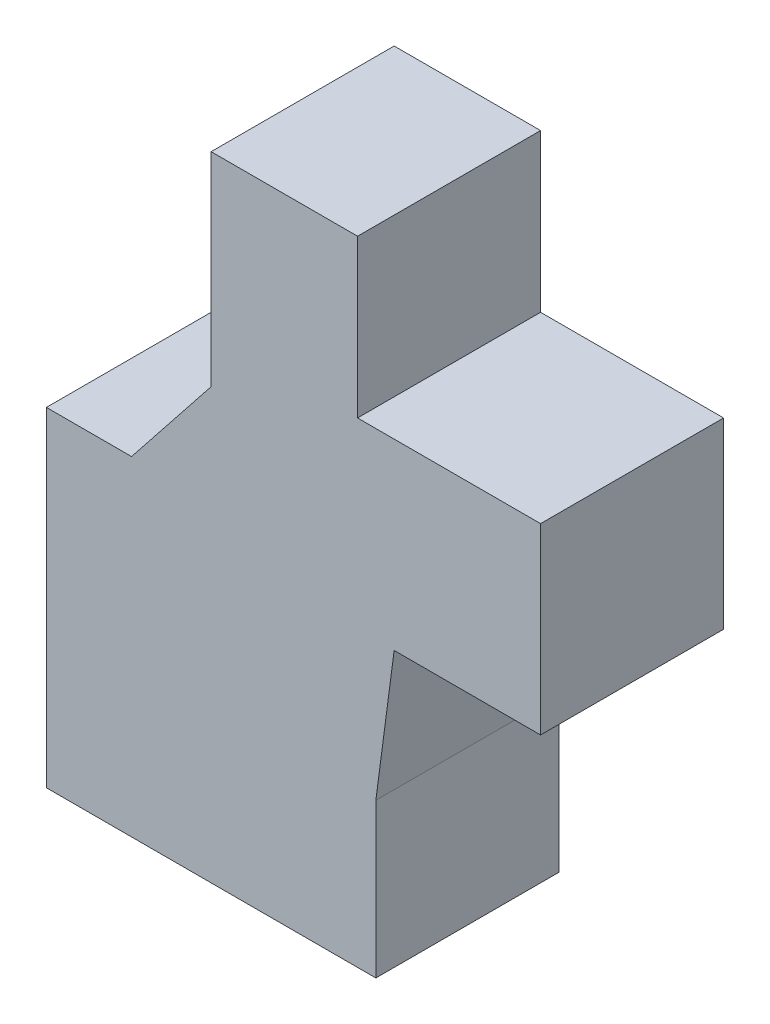
ISO-10303-21;
HEADER;
FILE_DESCRIPTION(('STEP AP214'),'2;1');
FILE_NAME('part.step','',(''),(''),'','','');
FILE_SCHEMA(('AUTOMOTIVE_DESIGN { 1 0 10303 214 1 1 1 1 }'));
ENDSEC;
DATA;
#1=APPLICATION_CONTEXT('core data for automotive mechanical design processes');
#2=APPLICATION_PROTOCOL_DEFINITION('international standard','automotive_design',2000,#1);
#3=PRODUCT_CONTEXT('',#1,'mechanical');
#4=PRODUCT('Part','Part','',(#3));
#5=PRODUCT_RELATED_PRODUCT_CATEGORY('part','',(#4));
#6=PRODUCT_DEFINITION_FORMATION('','',#4);
#7=PRODUCT_DEFINITION_CONTEXT('part definition',#1,'design');
#8=PRODUCT_DEFINITION('design','',#6,#7);
#9=PRODUCT_DEFINITION_SHAPE('','',#8);
#10=(LENGTH_UNIT() NAMED_UNIT(*) SI_UNIT(.MILLI.,.METRE.));
#11=(NAMED_UNIT(*) PLANE_ANGLE_UNIT() SI_UNIT($,.RADIAN.));
#12=(NAMED_UNIT(*) SI_UNIT($,.STERADIAN.) SOLID_ANGLE_UNIT());
#13=UNCERTAINTY_MEASURE_WITH_UNIT(LENGTH_MEASURE(1.E-05),#10,'distance_accuracy_value','');
#14=(GEOMETRIC_REPRESENTATION_CONTEXT(3) GLOBAL_UNCERTAINTY_ASSIGNED_CONTEXT((#13)) GLOBAL_UNIT_ASSIGNED_CONTEXT((#10,
#11,#12)) REPRESENTATION_CONTEXT('',''));
#15=CARTESIAN_POINT('',(0.,0.,0.));
#16=DIRECTION('',(0.,0.,1.));
#17=DIRECTION('',(1.,0.,0.));
#18=AXIS2_PLACEMENT_3D('',#15,#16,#17);
#19=CARTESIAN_POINT('',(-45.,0.,50.));
#20=DIRECTION('',(1.,0.,0.));
#21=DIRECTION('',(0.,1.,0.));
#22=AXIS2_PLACEMENT_3D('',#19,#20,#21);
#23=PLANE('',#22);
#24=DIRECTION('',(0.,-1.,0.));
#25=VECTOR('',#24,1.);
#26=CARTESIAN_POINT('',(-45.,0.,0.));
#27=LINE('',#26,#25);
#28=CARTESIAN_POINT('',(-45.,45.,0.));
#29=VERTEX_POINT('',#28);
#30=CARTESIAN_POINT('',(-45.,-45.,0.));
#31=VERTEX_POINT('',#30);
#32=EDGE_CURVE('E171',#29,#31,#27,.T.);
#33=ORIENTED_EDGE('',*,*,#32,.T.);
#34=DIRECTION('',(0.,0.,-1.));
#35=VECTOR('',#34,1.);
#36=CARTESIAN_POINT('',(-45.,-45.,50.));
#37=LINE('',#36,#35);
#38=CARTESIAN_POINT('',(-45.,-45.,50.));
#39=VERTEX_POINT('',#38);
#40=EDGE_CURVE('E167',#39,#31,#37,.T.);
#41=ORIENTED_EDGE('',*,*,#40,.F.);
#42=DIRECTION('',(0.,-1.,0.));
#43=VECTOR('',#42,1.);
#44=CARTESIAN_POINT('',(-45.,0.,50.));
#45=LINE('',#44,#43);
#46=CARTESIAN_POINT('',(-45.,45.,50.));
#47=VERTEX_POINT('',#46);
#48=EDGE_CURVE('E241',#47,#39,#45,.T.);
#49=ORIENTED_EDGE('',*,*,#48,.F.);
#50=DIRECTION('',(0.,0.,-1.));
#51=VECTOR('',#50,1.);
#52=CARTESIAN_POINT('',(-45.,45.,50.));
#53=LINE('',#52,#51);
#54=EDGE_CURVE('E193',#47,#29,#53,.T.);
#55=ORIENTED_EDGE('',*,*,#54,.T.);
#56=EDGE_LOOP('',(#33,#41,#49,#55));
#57=FACE_BOUND('',#56,.T.);
#58=ADVANCED_FACE('F92',(#57),#23,.F.);
#59=CARTESIAN_POINT('',(0.,45.,50.));
#60=DIRECTION('',(0.,1.,0.));
#61=DIRECTION('',(0.,0.,1.));
#62=AXIS2_PLACEMENT_3D('',#59,#60,#61);
#63=PLANE('',#62);
#64=DIRECTION('',(1.,0.,0.));
#65=VECTOR('',#64,1.);
#66=CARTESIAN_POINT('',(0.,45.,0.));
#67=LINE('',#66,#65);
#68=CARTESIAN_POINT('',(-21.7388419244326,45.,0.));
#69=VERTEX_POINT('',#68);
#70=EDGE_CURVE('E222',#29,#69,#67,.T.);
#71=ORIENTED_EDGE('',*,*,#70,.F.);
#72=ORIENTED_EDGE('',*,*,#54,.F.);
#73=DIRECTION('',(1.,0.,0.));
#74=VECTOR('',#73,1.);
#75=CARTESIAN_POINT('',(0.,45.,50.));
#76=LINE('',#75,#74);
#77=CARTESIAN_POINT('',(-21.7388419244326,45.,50.));
#78=VERTEX_POINT('',#77);
#79=EDGE_CURVE('E243',#47,#78,#76,.T.);
#80=ORIENTED_EDGE('',*,*,#79,.T.);
#81=DIRECTION('',(0.,0.,-1.));
#82=VECTOR('',#81,1.);
#83=CARTESIAN_POINT('',(-21.7388419244326,45.,50.));
#84=LINE('',#83,#82);
#85=EDGE_CURVE('E191',#78,#69,#84,.T.);
#86=ORIENTED_EDGE('',*,*,#85,.T.);
#87=EDGE_LOOP('',(#71,#72,#80,#86));
#88=FACE_BOUND('',#87,.T.);
#89=ADVANCED_FACE('F287',(#88),#63,.T.);
#90=CARTESIAN_POINT('',(0.,-45.,50.));
#91=DIRECTION('',(0.,1.,0.));
#92=DIRECTION('',(0.,0.,1.));
#93=AXIS2_PLACEMENT_3D('',#90,#91,#92);
#94=PLANE('',#93);
#95=DIRECTION('',(1.,0.,0.));
#96=VECTOR('',#95,1.);
#97=CARTESIAN_POINT('',(0.,-45.,0.));
#98=LINE('',#97,#96);
#99=CARTESIAN_POINT('',(45.,-45.,0.));
#100=VERTEX_POINT('',#99);
#101=EDGE_CURVE('E162',#31,#100,#98,.T.);
#102=ORIENTED_EDGE('',*,*,#101,.T.);
#103=DIRECTION('',(0.,0.,-1.));
#104=VECTOR('',#103,1.);
#105=CARTESIAN_POINT('',(45.,-45.,50.));
#106=LINE('',#105,#104);
#107=CARTESIAN_POINT('',(45.,-45.,50.));
#108=VERTEX_POINT('',#107);
#109=EDGE_CURVE('E96',#108,#100,#106,.T.);
#110=ORIENTED_EDGE('',*,*,#109,.F.);
#111=DIRECTION('',(1.,0.,0.));
#112=VECTOR('',#111,1.);
#113=CARTESIAN_POINT('',(0.,-45.,50.));
#114=LINE('',#113,#112);
#115=EDGE_CURVE('E155',#39,#108,#114,.T.);
#116=ORIENTED_EDGE('',*,*,#115,.F.);
#117=ORIENTED_EDGE('',*,*,#40,.T.);
#118=EDGE_LOOP('',(#102,#110,#116,#117));
#119=FACE_BOUND('',#118,.T.);
#120=ADVANCED_FACE('F164',(#119),#94,.F.);
#121=CARTESIAN_POINT('',(44.6144734505981,-5.87781921514029,50.));
#122=DIRECTION('',(0.991432743346626,-0.130618204780895,0.));
#123=DIRECTION('',(0.130618204780895,0.991432743346626,0.));
#124=AXIS2_PLACEMENT_3D('',#121,#122,#123);
#125=PLANE('',#124);
#126=DIRECTION('',(-0.130618204780895,-0.991432743346626,0.));
#127=VECTOR('',#126,1.);
#128=CARTESIAN_POINT('',(44.6144734505981,-5.87781921514029,0.));
#129=LINE('',#128,#127);
#130=CARTESIAN_POINT('',(50.,35.,0.));
#131=VERTEX_POINT('',#130);
#132=CARTESIAN_POINT('',(45.,-2.95155296345216,0.));
#133=VERTEX_POINT('',#132);
#134=EDGE_CURVE('E170',#131,#133,#129,.T.);
#135=ORIENTED_EDGE('',*,*,#134,.F.);
#136=DIRECTION('',(0.,0.,-1.));
#137=VECTOR('',#136,1.);
#138=CARTESIAN_POINT('',(50.,35.,50.));
#139=LINE('',#138,#137);
#140=CARTESIAN_POINT('',(50.,35.,50.));
#141=VERTEX_POINT('',#140);
#142=EDGE_CURVE('E198',#141,#131,#139,.T.);
#143=ORIENTED_EDGE('',*,*,#142,.F.);
#144=DIRECTION('',(-0.130618204780895,-0.991432743346626,0.));
#145=VECTOR('',#144,1.);
#146=CARTESIAN_POINT('',(44.6144734505981,-5.87781921514029,50.));
#147=LINE('',#146,#145);
#148=CARTESIAN_POINT('',(45.,-2.95155296345216,50.));
#149=VERTEX_POINT('',#148);
#150=EDGE_CURVE('E237',#141,#149,#147,.T.);
#151=ORIENTED_EDGE('',*,*,#150,.T.);
#152=DIRECTION('',(0.,0.,-1.));
#153=VECTOR('',#152,1.);
#154=CARTESIAN_POINT('',(45.,-2.95155296345216,50.));
#155=LINE('',#154,#153);
#156=EDGE_CURVE('E196',#149,#133,#155,.T.);
#157=ORIENTED_EDGE('',*,*,#156,.T.);
#158=EDGE_LOOP('',(#135,#143,#151,#157));
#159=FACE_BOUND('',#158,.T.);
#160=ADVANCED_FACE('F309',(#159),#125,.T.);
#161=CARTESIAN_POINT('',(0.,35.,50.));
#162=DIRECTION('',(0.,-1.,0.));
#163=DIRECTION('',(1.,0.,0.));
#164=AXIS2_PLACEMENT_3D('',#161,#162,#163);
#165=PLANE('',#164);
#166=DIRECTION('',(-1.,0.,0.));
#167=VECTOR('',#166,1.);
#168=CARTESIAN_POINT('',(0.,35.,0.));
#169=LINE('',#168,#167);
#170=CARTESIAN_POINT('',(90.,35.,0.));
#171=VERTEX_POINT('',#170);
#172=EDGE_CURVE('E218',#171,#131,#169,.T.);
#173=ORIENTED_EDGE('',*,*,#172,.F.);
#174=DIRECTION('',(0.,0.,-1.));
#175=VECTOR('',#174,1.);
#176=CARTESIAN_POINT('',(90.,35.,50.));
#177=LINE('',#176,#175);
#178=CARTESIAN_POINT('',(90.,35.,50.));
#179=VERTEX_POINT('',#178);
#180=EDGE_CURVE('E200',#179,#171,#177,.T.);
#181=ORIENTED_EDGE('',*,*,#180,.F.);
#182=DIRECTION('',(-1.,0.,0.));
#183=VECTOR('',#182,1.);
#184=CARTESIAN_POINT('',(0.,35.,50.));
#185=LINE('',#184,#183);
#186=EDGE_CURVE('E234',#179,#141,#185,.T.);
#187=ORIENTED_EDGE('',*,*,#186,.T.);
#188=ORIENTED_EDGE('',*,*,#142,.T.);
#189=EDGE_LOOP('',(#173,#181,#187,#188));
#190=FACE_BOUND('',#189,.T.);
#191=ADVANCED_FACE('F307',(#190),#165,.T.);
#192=CARTESIAN_POINT('',(90.,0.,50.));
#193=DIRECTION('',(1.,0.,0.));
#194=DIRECTION('',(0.,0.,-1.));
#195=AXIS2_PLACEMENT_3D('',#192,#193,#194);
#196=PLANE('',#195);
#197=DIRECTION('',(0.,-1.,0.));
#198=VECTOR('',#197,1.);
#199=CARTESIAN_POINT('',(90.,0.,0.));
#200=LINE('',#199,#198);
#201=CARTESIAN_POINT('',(90.,85.,0.));
#202=VERTEX_POINT('',#201);
#203=EDGE_CURVE('E215',#202,#171,#200,.T.);
#204=ORIENTED_EDGE('',*,*,#203,.F.);
#205=DIRECTION('',(0.,0.,-1.));
#206=VECTOR('',#205,1.);
#207=CARTESIAN_POINT('',(90.,85.,50.));
#208=LINE('',#207,#206);
#209=CARTESIAN_POINT('',(90.,85.,50.));
#210=VERTEX_POINT('',#209);
#211=EDGE_CURVE('E202',#210,#202,#208,.T.);
#212=ORIENTED_EDGE('',*,*,#211,.F.);
#213=DIRECTION('',(0.,-1.,0.));
#214=VECTOR('',#213,1.);
#215=CARTESIAN_POINT('',(90.,0.,50.));
#216=LINE('',#215,#214);
#217=EDGE_CURVE('E231',#210,#179,#216,.T.);
#218=ORIENTED_EDGE('',*,*,#217,.T.);
#219=ORIENTED_EDGE('',*,*,#180,.T.);
#220=EDGE_LOOP('',(#204,#212,#218,#219));
#221=FACE_BOUND('',#220,.T.);
#222=ADVANCED_FACE('F302',(#221),#196,.T.);
#223=CARTESIAN_POINT('',(0.,85.,50.));
#224=DIRECTION('',(0.,-1.,0.));
#225=DIRECTION('',(0.,0.,-1.));
#226=AXIS2_PLACEMENT_3D('',#223,#224,#225);
#227=PLANE('',#226);
#228=DIRECTION('',(-1.,0.,0.));
#229=VECTOR('',#228,1.);
#230=CARTESIAN_POINT('',(0.,85.,0.));
#231=LINE('',#230,#229);
#232=CARTESIAN_POINT('',(40.,85.,0.));
#233=VERTEX_POINT('',#232);
#234=EDGE_CURVE('E212',#202,#233,#231,.T.);
#235=ORIENTED_EDGE('',*,*,#234,.T.);
#236=DIRECTION('',(0.,0.,-1.));
#237=VECTOR('',#236,1.);
#238=CARTESIAN_POINT('',(40.,85.,50.));
#239=LINE('',#238,#237);
#240=CARTESIAN_POINT('',(40.,85.,50.));
#241=VERTEX_POINT('',#240);
#242=EDGE_CURVE('E204',#241,#233,#239,.T.);
#243=ORIENTED_EDGE('',*,*,#242,.F.);
#244=DIRECTION('',(-1.,0.,0.));
#245=VECTOR('',#244,1.);
#246=CARTESIAN_POINT('',(0.,85.,50.));
#247=LINE('',#246,#245);
#248=EDGE_CURVE('E229',#210,#241,#247,.T.);
#249=ORIENTED_EDGE('',*,*,#248,.F.);
#250=ORIENTED_EDGE('',*,*,#211,.T.);
#251=EDGE_LOOP('',(#235,#243,#249,#250));
#252=FACE_BOUND('',#251,.T.);
#253=ADVANCED_FACE('F266',(#252),#227,.F.);
#254=CARTESIAN_POINT('',(40.0000000000001,0.,50.));
#255=DIRECTION('',(1.,0.,0.));
#256=DIRECTION('',(0.,1.,0.));
#257=AXIS2_PLACEMENT_3D('',#254,#255,#256);
#258=PLANE('',#257);
#259=DIRECTION('',(0.,-1.,0.));
#260=VECTOR('',#259,1.);
#261=CARTESIAN_POINT('',(40.0000000000001,0.,0.));
#262=LINE('',#261,#260);
#263=CARTESIAN_POINT('',(40.,128.,0.));
#264=VERTEX_POINT('',#263);
#265=EDGE_CURVE('E208',#264,#233,#262,.T.);
#266=ORIENTED_EDGE('',*,*,#265,.F.);
#267=DIRECTION('',(0.,0.,-1.));
#268=VECTOR('',#267,1.);
#269=CARTESIAN_POINT('',(40.,128.,50.));
#270=LINE('',#269,#268);
#271=CARTESIAN_POINT('',(40.,128.,50.));
#272=VERTEX_POINT('',#271);
#273=EDGE_CURVE('E111',#272,#264,#270,.T.);
#274=ORIENTED_EDGE('',*,*,#273,.F.);
#275=DIRECTION('',(0.,-1.,0.));
#276=VECTOR('',#275,1.);
#277=CARTESIAN_POINT('',(40.0000000000001,0.,50.));
#278=LINE('',#277,#276);
#279=EDGE_CURVE('E207',#272,#241,#278,.T.);
#280=ORIENTED_EDGE('',*,*,#279,.T.);
#281=ORIENTED_EDGE('',*,*,#242,.T.);
#282=EDGE_LOOP('',(#266,#274,#280,#281));
#283=FACE_BOUND('',#282,.T.);
#284=ADVANCED_FACE('F263',(#283),#258,.T.);
#285=CARTESIAN_POINT('',(0.,128.,50.));
#286=DIRECTION('',(0.,1.,0.));
#287=DIRECTION('',(-1.,0.,0.));
#288=AXIS2_PLACEMENT_3D('',#285,#286,#287);
#289=PLANE('',#288);
#290=DIRECTION('',(1.,0.,0.));
#291=VECTOR('',#290,1.);
#292=CARTESIAN_POINT('',(0.,128.,0.));
#293=LINE('',#292,#291);
#294=CARTESIAN_POINT('',(0.,128.,0.));
#295=VERTEX_POINT('',#294);
#296=EDGE_CURVE('E183',#295,#264,#293,.T.);
#297=ORIENTED_EDGE('',*,*,#296,.F.);
#298=DIRECTION('',(0.,0.,-1.));
#299=VECTOR('',#298,1.);
#300=CARTESIAN_POINT('',(0.,128.,50.));
#301=LINE('',#300,#299);
#302=CARTESIAN_POINT('',(0.,128.,50.));
#303=VERTEX_POINT('',#302);
#304=EDGE_CURVE('E12',#303,#295,#301,.T.);
#305=ORIENTED_EDGE('',*,*,#304,.F.);
#306=DIRECTION('',(1.,0.,0.));
#307=VECTOR('',#306,1.);
#308=CARTESIAN_POINT('',(0.,128.,50.));
#309=LINE('',#308,#307);
#310=EDGE_CURVE('E211',#303,#272,#309,.T.);
#311=ORIENTED_EDGE('',*,*,#310,.T.);
#312=ORIENTED_EDGE('',*,*,#273,.T.);
#313=EDGE_LOOP('',(#297,#305,#311,#312));
#314=FACE_BOUND('',#313,.T.);
#315=ADVANCED_FACE('F257',(#314),#289,.T.);
#316=CARTESIAN_POINT('',(0.,0.,50.));
#317=DIRECTION('',(1.,0.,0.));
#318=DIRECTION('',(0.,1.,0.));
#319=AXIS2_PLACEMENT_3D('',#316,#317,#318);
#320=PLANE('',#319);
#321=DIRECTION('',(0.,-1.,0.));
#322=VECTOR('',#321,1.);
#323=CARTESIAN_POINT('',(0.,0.,0.));
#324=LINE('',#323,#322);
#325=CARTESIAN_POINT('',(0.,72.3971457133702,0.));
#326=VERTEX_POINT('',#325);
#327=EDGE_CURVE('E185',#295,#326,#324,.T.);
#328=ORIENTED_EDGE('',*,*,#327,.T.);
#329=DIRECTION('',(0.,0.,-1.));
#330=VECTOR('',#329,1.);
#331=CARTESIAN_POINT('',(0.,72.3971457133702,50.));
#332=LINE('',#331,#330);
#333=CARTESIAN_POINT('',(0.,72.3971457133702,50.));
#334=VERTEX_POINT('',#333);
#335=EDGE_CURVE('E102',#334,#326,#332,.T.);
#336=ORIENTED_EDGE('',*,*,#335,.F.);
#337=DIRECTION('',(0.,-1.,0.));
#338=VECTOR('',#337,1.);
#339=CARTESIAN_POINT('',(0.,0.,50.));
#340=LINE('',#339,#338);
#341=EDGE_CURVE('E249',#303,#334,#340,.T.);
#342=ORIENTED_EDGE('',*,*,#341,.F.);
#343=ORIENTED_EDGE('',*,*,#304,.T.);
#344=EDGE_LOOP('',(#328,#336,#342,#343));
#345=FACE_BOUND('',#344,.T.);
#346=ADVANCED_FACE('F273',(#345),#320,.F.);
#347=CARTESIAN_POINT('',(-35.2510857699631,27.9707159729369,50.));
#348=DIRECTION('',(0.783357461554736,-0.621571466065264,0.));
#349=DIRECTION('',(0.621571466065264,0.783357461554736,0.));
#350=AXIS2_PLACEMENT_3D('',#347,#348,#349);
#351=PLANE('',#350);
#352=DIRECTION('',(-0.621571466065263,-0.783357461554736,0.));
#353=VECTOR('',#352,1.);
#354=CARTESIAN_POINT('',(-35.2510857699631,27.9707159729369,0.));
#355=LINE('',#354,#353);
#356=EDGE_CURVE('E224',#326,#69,#355,.T.);
#357=ORIENTED_EDGE('',*,*,#356,.T.);
#358=ORIENTED_EDGE('',*,*,#85,.F.);
#359=DIRECTION('',(-0.621571466065263,-0.783357461554736,0.));
#360=VECTOR('',#359,1.);
#361=CARTESIAN_POINT('',(-35.2510857699631,27.9707159729369,50.));
#362=LINE('',#361,#360);
#363=EDGE_CURVE('E246',#334,#78,#362,.T.);
#364=ORIENTED_EDGE('',*,*,#363,.F.);
#365=ORIENTED_EDGE('',*,*,#335,.T.);
#366=EDGE_LOOP('',(#357,#358,#364,#365));
#367=FACE_BOUND('',#366,.T.);
#368=ADVANCED_FACE('F277',(#367),#351,.F.);
#369=CARTESIAN_POINT('',(0.,0.,0.));
#370=DIRECTION('',(0.,0.,1.));
#371=DIRECTION('',(1.,0.,0.));
#372=AXIS2_PLACEMENT_3D('',#369,#370,#371);
#373=PLANE('',#372);
#374=ORIENTED_EDGE('',*,*,#70,.T.);
#375=ORIENTED_EDGE('',*,*,#356,.F.);
#376=ORIENTED_EDGE('',*,*,#327,.F.);
#377=ORIENTED_EDGE('',*,*,#296,.T.);
#378=ORIENTED_EDGE('',*,*,#265,.T.);
#379=ORIENTED_EDGE('',*,*,#234,.F.);
#380=ORIENTED_EDGE('',*,*,#203,.T.);
#381=ORIENTED_EDGE('',*,*,#172,.T.);
#382=ORIENTED_EDGE('',*,*,#134,.T.);
#383=DIRECTION('',(0.,-1.,0.));
#384=VECTOR('',#383,1.);
#385=CARTESIAN_POINT('',(45.,45.,0.));
#386=LINE('',#385,#384);
#387=EDGE_CURVE('E175',#133,#100,#386,.T.);
#388=ORIENTED_EDGE('',*,*,#387,.T.);
#389=ORIENTED_EDGE('',*,*,#101,.F.);
#390=ORIENTED_EDGE('',*,*,#32,.F.);
#391=EDGE_LOOP('',(#374,#375,#376,#377,#378,#379,#380,#381,#382,#388,#389,#390));
#392=FACE_BOUND('',#391,.T.);
#393=ADVANCED_FACE('F177',(#392),#373,.F.);
#394=CARTESIAN_POINT('',(0.,0.,50.));
#395=DIRECTION('',(0.,0.,1.));
#396=DIRECTION('',(1.,0.,0.));
#397=AXIS2_PLACEMENT_3D('',#394,#395,#396);
#398=PLANE('',#397);
#399=ORIENTED_EDGE('',*,*,#363,.T.);
#400=ORIENTED_EDGE('',*,*,#79,.F.);
#401=ORIENTED_EDGE('',*,*,#48,.T.);
#402=ORIENTED_EDGE('',*,*,#115,.T.);
#403=DIRECTION('',(0.,-1.,0.));
#404=VECTOR('',#403,1.);
#405=CARTESIAN_POINT('',(45.,45.,50.));
#406=LINE('',#405,#404);
#407=EDGE_CURVE('E182',#149,#108,#406,.T.);
#408=ORIENTED_EDGE('',*,*,#407,.F.);
#409=ORIENTED_EDGE('',*,*,#150,.F.);
#410=ORIENTED_EDGE('',*,*,#186,.F.);
#411=ORIENTED_EDGE('',*,*,#217,.F.);
#412=ORIENTED_EDGE('',*,*,#248,.T.);
#413=ORIENTED_EDGE('',*,*,#279,.F.);
#414=ORIENTED_EDGE('',*,*,#310,.F.);
#415=ORIENTED_EDGE('',*,*,#341,.T.);
#416=EDGE_LOOP('',(#399,#400,#401,#402,#408,#409,#410,#411,#412,#413,#414,#415));
#417=FACE_BOUND('',#416,.T.);
#418=ADVANCED_FACE('F259',(#417),#398,.T.);
#419=CARTESIAN_POINT('',(45.,45.,50.));
#420=DIRECTION('',(1.,0.,0.));
#421=DIRECTION('',(0.,1.,0.));
#422=AXIS2_PLACEMENT_3D('',#419,#420,#421);
#423=PLANE('',#422);
#424=ORIENTED_EDGE('',*,*,#387,.F.);
#425=ORIENTED_EDGE('',*,*,#156,.F.);
#426=ORIENTED_EDGE('',*,*,#407,.T.);
#427=ORIENTED_EDGE('',*,*,#109,.T.);
#428=EDGE_LOOP('',(#424,#425,#426,#427));
#429=FACE_BOUND('',#428,.T.);
#430=ADVANCED_FACE('F94',(#429),#423,.T.);
#431=CLOSED_SHELL('',(#58,#89,#120,#160,#191,#222,#253,#284,#315,#346,#368,#393,#418,#430));
#432=MANIFOLD_SOLID_BREP('B2',#431);
#433=ADVANCED_BREP_SHAPE_REPRESENTATION('',(#18,#432),#14);
#434=SHAPE_DEFINITION_REPRESENTATION(#9,#433);
ENDSEC;
END-ISO-10303-21;
